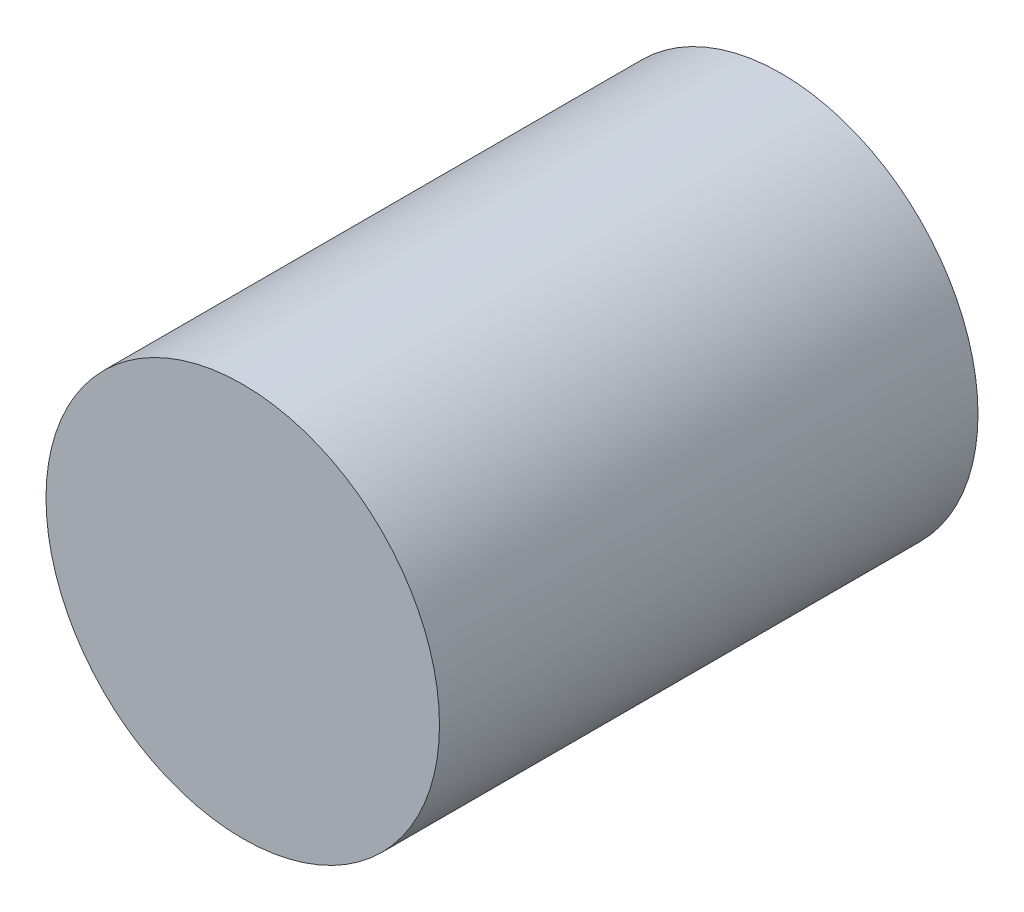
ISO-10303-21;
HEADER;
FILE_DESCRIPTION(('STEP AP214'),'2;1');
FILE_NAME('part.step','',(''),(''),'','','');
FILE_SCHEMA(('AUTOMOTIVE_DESIGN { 1 0 10303 214 1 1 1 1 }'));
ENDSEC;
DATA;
#1=APPLICATION_CONTEXT('core data for automotive mechanical design processes');
#2=APPLICATION_PROTOCOL_DEFINITION('international standard','automotive_design',2000,#1);
#3=PRODUCT_CONTEXT('',#1,'mechanical');
#4=PRODUCT('Part','Part','',(#3));
#5=PRODUCT_RELATED_PRODUCT_CATEGORY('part','',(#4));
#6=PRODUCT_DEFINITION_FORMATION('','',#4);
#7=PRODUCT_DEFINITION_CONTEXT('part definition',#1,'design');
#8=PRODUCT_DEFINITION('design','',#6,#7);
#9=PRODUCT_DEFINITION_SHAPE('','',#8);
#10=(LENGTH_UNIT() NAMED_UNIT(*) SI_UNIT(.MILLI.,.METRE.));
#11=(NAMED_UNIT(*) PLANE_ANGLE_UNIT() SI_UNIT($,.RADIAN.));
#12=(NAMED_UNIT(*) SI_UNIT($,.STERADIAN.) SOLID_ANGLE_UNIT());
#13=UNCERTAINTY_MEASURE_WITH_UNIT(LENGTH_MEASURE(1.E-05),#10,'distance_accuracy_value','');
#14=(GEOMETRIC_REPRESENTATION_CONTEXT(3) GLOBAL_UNCERTAINTY_ASSIGNED_CONTEXT((#13)) GLOBAL_UNIT_ASSIGNED_CONTEXT((#10,
#11,#12)) REPRESENTATION_CONTEXT('',''));
#15=CARTESIAN_POINT('',(0.,0.,0.));
#16=DIRECTION('',(0.,0.,1.));
#17=DIRECTION('',(1.,0.,0.));
#18=AXIS2_PLACEMENT_3D('',#15,#16,#17);
#19=CARTESIAN_POINT('',(0.,0.,0.));
#20=DIRECTION('',(0.,0.,-1.));
#21=DIRECTION('',(-1.,0.,0.));
#22=AXIS2_PLACEMENT_3D('',#19,#20,#21);
#23=PLANE('',#22);
#24=CARTESIAN_POINT('',(0.,0.,0.));
#25=DIRECTION('',(0.,0.,1.));
#26=DIRECTION('',(1.,0.,0.));
#27=AXIS2_PLACEMENT_3D('',#24,#25,#26);
#28=CIRCLE('',#27,6.9596);
#29=CARTESIAN_POINT('',(6.9596,0.,0.));
#30=VERTEX_POINT('',#29);
#31=EDGE_CURVE('E10',#30,#30,#28,.T.);
#32=ORIENTED_EDGE('',*,*,#31,.T.);
#33=EDGE_LOOP('',(#32));
#34=FACE_BOUND('',#33,.T.);
#35=ADVANCED_FACE('F37',(#34),#23,.F.);
#36=CARTESIAN_POINT('',(0.,0.,0.));
#37=DIRECTION('',(0.,0.,1.));
#38=DIRECTION('',(1.,0.,0.));
#39=AXIS2_PLACEMENT_3D('',#36,#37,#38);
#40=CYLINDRICAL_SURFACE('',#39,6.9596);
#41=ORIENTED_EDGE('',*,*,#31,.F.);
#42=EDGE_LOOP('',(#41));
#43=FACE_BOUND('',#42,.T.);
#44=CARTESIAN_POINT('',(0.,0.,-19.05));
#45=DIRECTION('',(0.,0.,1.));
#46=DIRECTION('',(1.,0.,0.));
#47=AXIS2_PLACEMENT_3D('',#44,#45,#46);
#48=CIRCLE('',#47,6.9596);
#49=CARTESIAN_POINT('',(6.9596,0.,-19.05));
#50=VERTEX_POINT('',#49);
#51=EDGE_CURVE('E43',#50,#50,#48,.T.);
#52=ORIENTED_EDGE('',*,*,#51,.T.);
#53=EDGE_LOOP('',(#52));
#54=FACE_BOUND('',#53,.T.);
#55=ADVANCED_FACE('F49',(#43,#54),#40,.T.);
#56=CARTESIAN_POINT('',(0.,6.9596,-19.05));
#57=DIRECTION('',(0.,0.,1.));
#58=DIRECTION('',(1.,0.,0.));
#59=AXIS2_PLACEMENT_3D('',#56,#57,#58);
#60=PLANE('',#59);
#61=ORIENTED_EDGE('',*,*,#51,.F.);
#62=EDGE_LOOP('',(#61));
#63=FACE_BOUND('',#62,.T.);
#64=ADVANCED_FACE('F51',(#63),#60,.F.);
#65=CLOSED_SHELL('',(#35,#55,#64));
#66=MANIFOLD_SOLID_BREP('B2',#65);
#67=ADVANCED_BREP_SHAPE_REPRESENTATION('',(#18,#66),#14);
#68=SHAPE_DEFINITION_REPRESENTATION(#9,#67);
ENDSEC;
END-ISO-10303-21;
